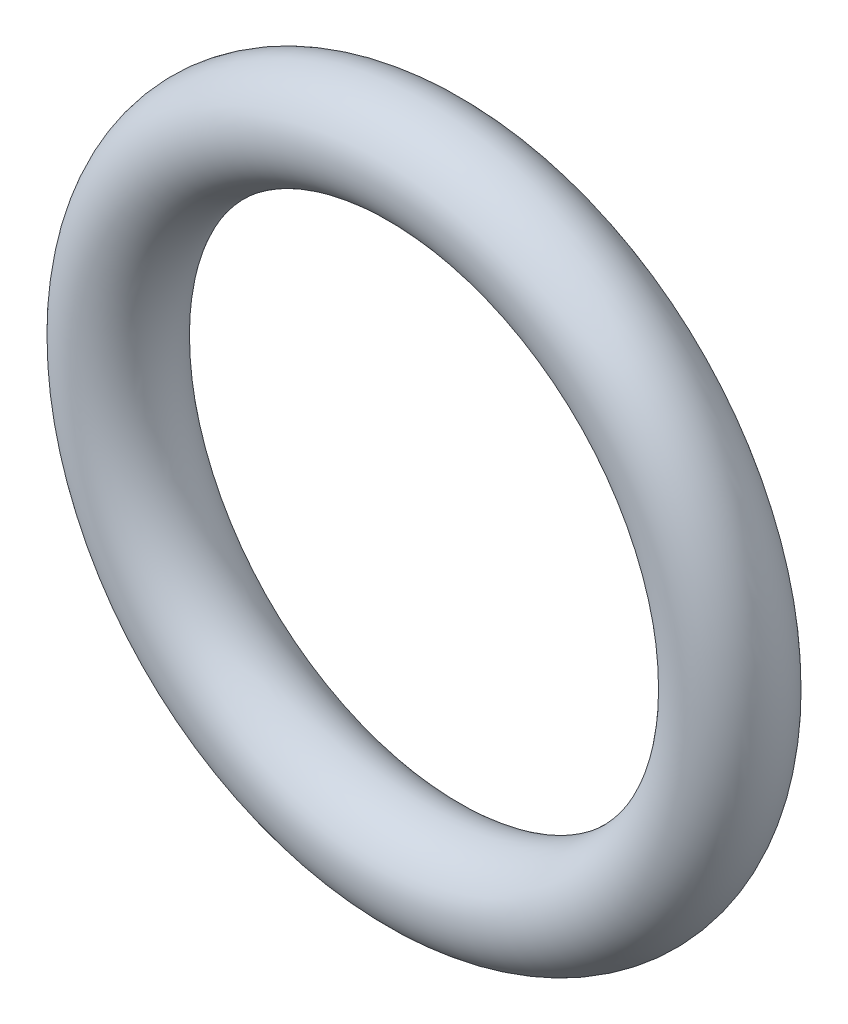
ISO-10303-21;
HEADER;
FILE_DESCRIPTION(('STEP AP214'),'2;1');
FILE_NAME('part.step','',(''),(''),'','','');
FILE_SCHEMA(('AUTOMOTIVE_DESIGN { 1 0 10303 214 1 1 1 1 }'));
ENDSEC;
DATA;
#1=APPLICATION_CONTEXT('core data for automotive mechanical design processes');
#2=APPLICATION_PROTOCOL_DEFINITION('international standard','automotive_design',2000,#1);
#3=PRODUCT_CONTEXT('',#1,'mechanical');
#4=PRODUCT('Part','Part','',(#3));
#5=PRODUCT_RELATED_PRODUCT_CATEGORY('part','',(#4));
#6=PRODUCT_DEFINITION_FORMATION('','',#4);
#7=PRODUCT_DEFINITION_CONTEXT('part definition',#1,'design');
#8=PRODUCT_DEFINITION('design','',#6,#7);
#9=PRODUCT_DEFINITION_SHAPE('','',#8);
#10=(LENGTH_UNIT() NAMED_UNIT(*) SI_UNIT(.MILLI.,.METRE.));
#11=(NAMED_UNIT(*) PLANE_ANGLE_UNIT() SI_UNIT($,.RADIAN.));
#12=(NAMED_UNIT(*) SI_UNIT($,.STERADIAN.) SOLID_ANGLE_UNIT());
#13=UNCERTAINTY_MEASURE_WITH_UNIT(LENGTH_MEASURE(1.E-05),#10,'distance_accuracy_value','');
#14=(GEOMETRIC_REPRESENTATION_CONTEXT(3) GLOBAL_UNCERTAINTY_ASSIGNED_CONTEXT((#13)) GLOBAL_UNIT_ASSIGNED_CONTEXT((#10,
#11,#12)) REPRESENTATION_CONTEXT('',''));
#15=CARTESIAN_POINT('',(0.,0.,0.));
#16=DIRECTION('',(0.,0.,1.));
#17=DIRECTION('',(1.,0.,0.));
#18=AXIS2_PLACEMENT_3D('',#15,#16,#17);
#19=CARTESIAN_POINT('',(0.,0.,0.));
#20=DIRECTION('',(0.,0.,-1.));
#21=DIRECTION('',(-1.,0.,0.));
#22=AXIS2_PLACEMENT_3D('',#19,#20,#21);
#23=TOROIDAL_SURFACE('',#22,4.6228,0.762000000000001);
#24=CARTESIAN_POINT('',(-5.3848,0.,0.));
#25=VERTEX_POINT('',#24);
#26=VERTEX_LOOP('',#25);
#27=FACE_BOUND('',#26,.T.);
#28=ADVANCED_FACE('F28',(#27),#23,.T.);
#29=CLOSED_SHELL('',(#28));
#30=MANIFOLD_SOLID_BREP('B2',#29);
#31=ADVANCED_BREP_SHAPE_REPRESENTATION('',(#18,#30),#14);
#32=SHAPE_DEFINITION_REPRESENTATION(#9,#31);
ENDSEC;
END-ISO-10303-21;
